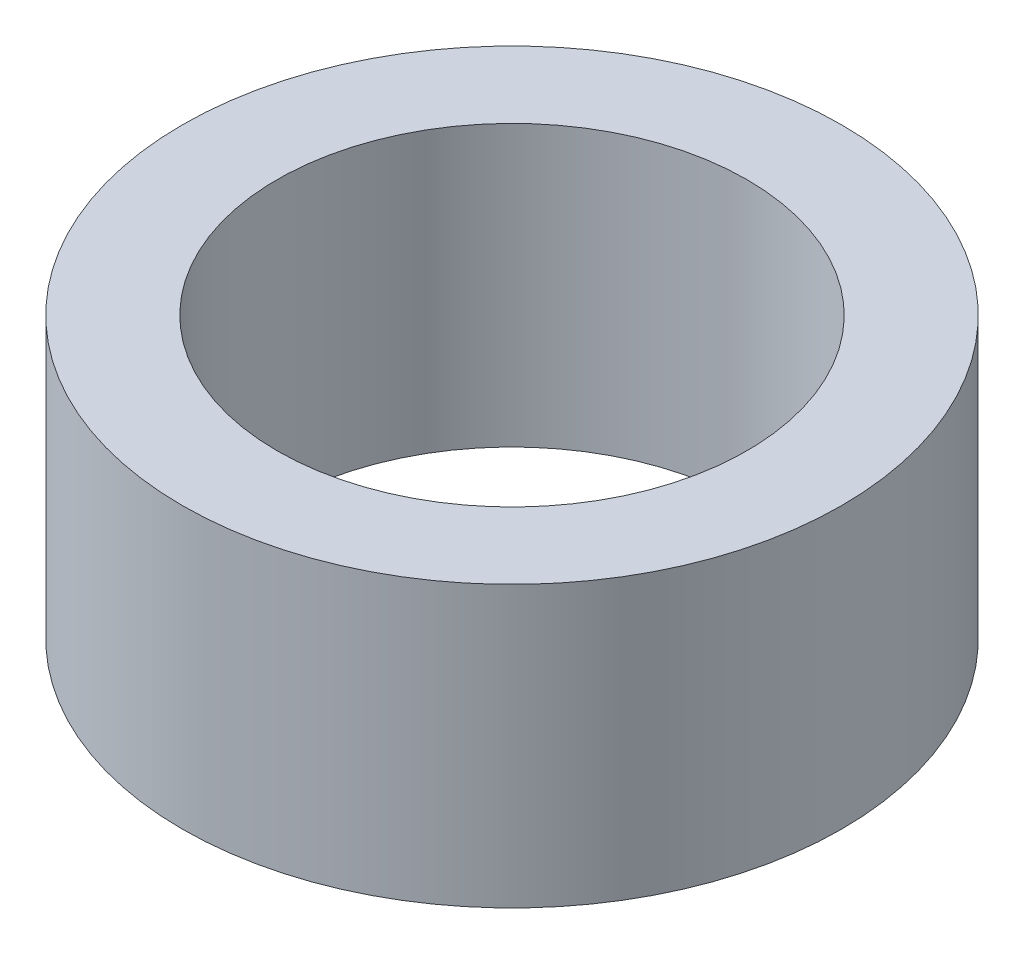
ISO-10303-21;
HEADER;
FILE_DESCRIPTION(('STEP AP214'),'2;1');
FILE_NAME('part.step','',(''),(''),'','','');
FILE_SCHEMA(('AUTOMOTIVE_DESIGN { 1 0 10303 214 1 1 1 1 }'));
ENDSEC;
DATA;
#1=APPLICATION_CONTEXT('core data for automotive mechanical design processes');
#2=APPLICATION_PROTOCOL_DEFINITION('international standard','automotive_design',2000,#1);
#3=PRODUCT_CONTEXT('',#1,'mechanical');
#4=PRODUCT('Part','Part','',(#3));
#5=PRODUCT_RELATED_PRODUCT_CATEGORY('part','',(#4));
#6=PRODUCT_DEFINITION_FORMATION('','',#4);
#7=PRODUCT_DEFINITION_CONTEXT('part definition',#1,'design');
#8=PRODUCT_DEFINITION('design','',#6,#7);
#9=PRODUCT_DEFINITION_SHAPE('','',#8);
#10=(LENGTH_UNIT() NAMED_UNIT(*) SI_UNIT(.MILLI.,.METRE.));
#11=(NAMED_UNIT(*) PLANE_ANGLE_UNIT() SI_UNIT($,.RADIAN.));
#12=(NAMED_UNIT(*) SI_UNIT($,.STERADIAN.) SOLID_ANGLE_UNIT());
#13=UNCERTAINTY_MEASURE_WITH_UNIT(LENGTH_MEASURE(1.E-05),#10,'distance_accuracy_value','');
#14=(GEOMETRIC_REPRESENTATION_CONTEXT(3) GLOBAL_UNCERTAINTY_ASSIGNED_CONTEXT((#13)) GLOBAL_UNIT_ASSIGNED_CONTEXT((#10,
#11,#12)) REPRESENTATION_CONTEXT('',''));
#15=CARTESIAN_POINT('',(0.,0.,0.));
#16=DIRECTION('',(0.,0.,1.));
#17=DIRECTION('',(1.,0.,0.));
#18=AXIS2_PLACEMENT_3D('',#15,#16,#17);
#19=CARTESIAN_POINT('',(0.,3.4,0.));
#20=DIRECTION('',(0.,1.,0.));
#21=DIRECTION('',(0.,0.,1.));
#22=AXIS2_PLACEMENT_3D('',#19,#20,#21);
#23=PLANE('',#22);
#24=CARTESIAN_POINT('',(0.,3.4,0.));
#25=DIRECTION('',(0.,1.,0.));
#26=DIRECTION('',(0.,0.,1.));
#27=AXIS2_PLACEMENT_3D('',#24,#25,#26);
#28=CIRCLE('',#27,4.);
#29=CARTESIAN_POINT('',(0.,3.4,4.));
#30=VERTEX_POINT('',#29);
#31=EDGE_CURVE('E10',#30,#30,#28,.T.);
#32=ORIENTED_EDGE('',*,*,#31,.T.);
#33=EDGE_LOOP('',(#32));
#34=FACE_BOUND('',#33,.T.);
#35=CARTESIAN_POINT('',(0.,3.4,0.));
#36=DIRECTION('',(0.,1.,0.));
#37=DIRECTION('',(0.,0.,1.));
#38=AXIS2_PLACEMENT_3D('',#35,#36,#37);
#39=CIRCLE('',#38,2.85);
#40=CARTESIAN_POINT('',(0.,3.4,2.85));
#41=VERTEX_POINT('',#40);
#42=EDGE_CURVE('E42',#41,#41,#39,.T.);
#43=ORIENTED_EDGE('',*,*,#42,.F.);
#44=EDGE_LOOP('',(#43));
#45=FACE_BOUND('',#44,.T.);
#46=ADVANCED_FACE('F31',(#34,#45),#23,.T.);
#47=CARTESIAN_POINT('',(0.,0.,0.));
#48=DIRECTION('',(0.,1.,0.));
#49=DIRECTION('',(0.,0.,1.));
#50=AXIS2_PLACEMENT_3D('',#47,#48,#49);
#51=PLANE('',#50);
#52=CARTESIAN_POINT('',(0.,0.,0.));
#53=DIRECTION('',(0.,1.,0.));
#54=DIRECTION('',(0.,0.,1.));
#55=AXIS2_PLACEMENT_3D('',#52,#53,#54);
#56=CIRCLE('',#55,4.);
#57=CARTESIAN_POINT('',(0.,0.,4.));
#58=VERTEX_POINT('',#57);
#59=EDGE_CURVE('E35',#58,#58,#56,.T.);
#60=ORIENTED_EDGE('',*,*,#59,.F.);
#61=EDGE_LOOP('',(#60));
#62=FACE_BOUND('',#61,.T.);
#63=CARTESIAN_POINT('',(0.,0.,0.));
#64=DIRECTION('',(0.,1.,0.));
#65=DIRECTION('',(0.,0.,1.));
#66=AXIS2_PLACEMENT_3D('',#63,#64,#65);
#67=CIRCLE('',#66,2.85);
#68=CARTESIAN_POINT('',(0.,0.,2.85));
#69=VERTEX_POINT('',#68);
#70=EDGE_CURVE('E44',#69,#69,#67,.T.);
#71=ORIENTED_EDGE('',*,*,#70,.T.);
#72=EDGE_LOOP('',(#71));
#73=FACE_BOUND('',#72,.T.);
#74=ADVANCED_FACE('F54',(#62,#73),#51,.F.);
#75=CARTESIAN_POINT('',(0.,3.4,0.));
#76=DIRECTION('',(0.,-1.,0.));
#77=DIRECTION('',(0.,0.,-1.));
#78=AXIS2_PLACEMENT_3D('',#75,#76,#77);
#79=CYLINDRICAL_SURFACE('',#78,4.);
#80=ORIENTED_EDGE('',*,*,#31,.F.);
#81=EDGE_LOOP('',(#80));
#82=FACE_BOUND('',#81,.T.);
#83=ORIENTED_EDGE('',*,*,#59,.T.);
#84=EDGE_LOOP('',(#83));
#85=FACE_BOUND('',#84,.T.);
#86=ADVANCED_FACE('F33',(#82,#85),#79,.T.);
#87=CARTESIAN_POINT('',(0.,3.4,0.));
#88=DIRECTION('',(0.,-1.,0.));
#89=DIRECTION('',(0.,0.,-1.));
#90=AXIS2_PLACEMENT_3D('',#87,#88,#89);
#91=CYLINDRICAL_SURFACE('',#90,2.85);
#92=ORIENTED_EDGE('',*,*,#42,.T.);
#93=EDGE_LOOP('',(#92));
#94=FACE_BOUND('',#93,.T.);
#95=ORIENTED_EDGE('',*,*,#70,.F.);
#96=EDGE_LOOP('',(#95));
#97=FACE_BOUND('',#96,.T.);
#98=ADVANCED_FACE('F50',(#94,#97),#91,.F.);
#99=CLOSED_SHELL('',(#46,#74,#86,#98));
#100=MANIFOLD_SOLID_BREP('B2',#99);
#101=ADVANCED_BREP_SHAPE_REPRESENTATION('',(#18,#100),#14);
#102=SHAPE_DEFINITION_REPRESENTATION(#9,#101);
ENDSEC;
END-ISO-10303-21;
